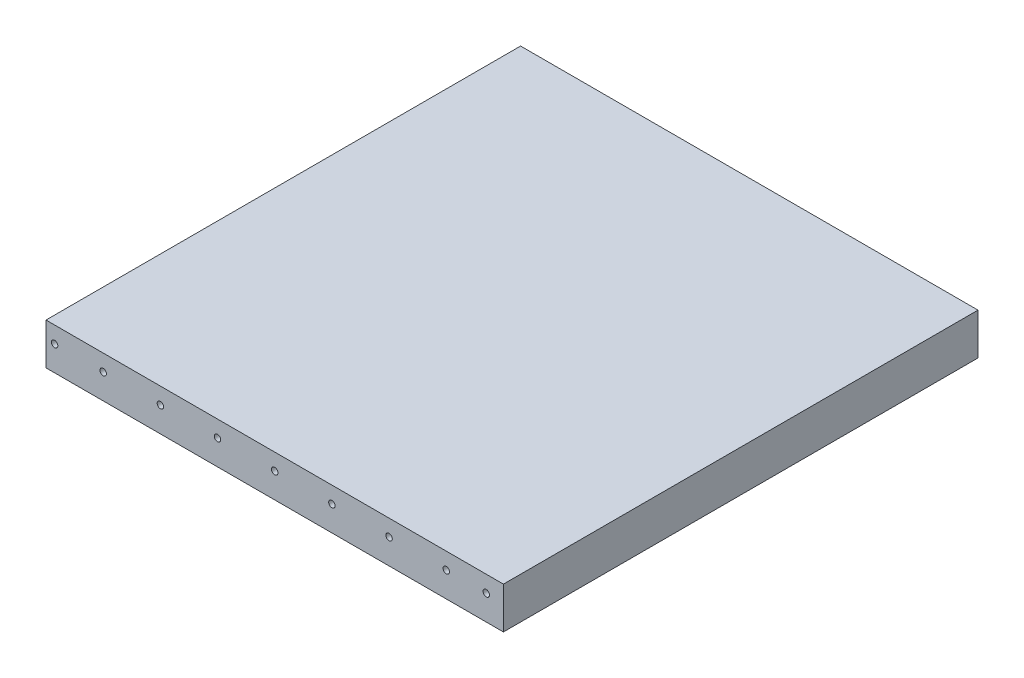
ISO-10303-21;
HEADER;
FILE_DESCRIPTION(('STEP AP214'),'2;1');
FILE_NAME('part.step','',(''),(''),'','','');
FILE_SCHEMA(('AUTOMOTIVE_DESIGN { 1 0 10303 214 1 1 1 1 }'));
ENDSEC;
DATA;
#1=APPLICATION_CONTEXT('core data for automotive mechanical design processes');
#2=APPLICATION_PROTOCOL_DEFINITION('international standard','automotive_design',2000,#1);
#3=PRODUCT_CONTEXT('',#1,'mechanical');
#4=PRODUCT('Part','Part','',(#3));
#5=PRODUCT_RELATED_PRODUCT_CATEGORY('part','',(#4));
#6=PRODUCT_DEFINITION_FORMATION('','',#4);
#7=PRODUCT_DEFINITION_CONTEXT('part definition',#1,'design');
#8=PRODUCT_DEFINITION('design','',#6,#7);
#9=PRODUCT_DEFINITION_SHAPE('','',#8);
#10=(LENGTH_UNIT() NAMED_UNIT(*) SI_UNIT(.MILLI.,.METRE.));
#11=(NAMED_UNIT(*) PLANE_ANGLE_UNIT() SI_UNIT($,.RADIAN.));
#12=(NAMED_UNIT(*) SI_UNIT($,.STERADIAN.) SOLID_ANGLE_UNIT());
#13=UNCERTAINTY_MEASURE_WITH_UNIT(LENGTH_MEASURE(1.E-05),#10,'distance_accuracy_value','');
#14=(GEOMETRIC_REPRESENTATION_CONTEXT(3) GLOBAL_UNCERTAINTY_ASSIGNED_CONTEXT((#13)) GLOBAL_UNIT_ASSIGNED_CONTEXT((#10,
#11,#12)) REPRESENTATION_CONTEXT('',''));
#15=CARTESIAN_POINT('',(0.,0.,0.));
#16=DIRECTION('',(0.,0.,1.));
#17=DIRECTION('',(1.,0.,0.));
#18=AXIS2_PLACEMENT_3D('',#15,#16,#17);
#19=CARTESIAN_POINT('',(0.,0.,2108.2));
#20=DIRECTION('',(1.,0.,0.));
#21=DIRECTION('',(0.,0.,-1.));
#22=AXIS2_PLACEMENT_3D('',#19,#20,#21);
#23=PLANE('',#22);
#24=DIRECTION('',(0.,-1.,0.));
#25=VECTOR('',#24,1.);
#26=CARTESIAN_POINT('',(0.,0.,0.));
#27=LINE('',#26,#25);
#28=CARTESIAN_POINT('',(0.,184.15,0.));
#29=VERTEX_POINT('',#28);
#30=CARTESIAN_POINT('',(0.,0.,0.));
#31=VERTEX_POINT('',#30);
#32=EDGE_CURVE('E102',#29,#31,#27,.T.);
#33=ORIENTED_EDGE('',*,*,#32,.T.);
#34=DIRECTION('',(0.,0.,-1.));
#35=VECTOR('',#34,1.);
#36=CARTESIAN_POINT('',(0.,0.,2108.2));
#37=LINE('',#36,#35);
#38=CARTESIAN_POINT('',(0.,0.,2108.2));
#39=VERTEX_POINT('',#38);
#40=EDGE_CURVE('E11',#39,#31,#37,.T.);
#41=ORIENTED_EDGE('',*,*,#40,.F.);
#42=DIRECTION('',(0.,-1.,0.));
#43=VECTOR('',#42,1.);
#44=CARTESIAN_POINT('',(0.,0.,2108.2));
#45=LINE('',#44,#43);
#46=CARTESIAN_POINT('',(0.,184.15,2108.2));
#47=VERTEX_POINT('',#46);
#48=EDGE_CURVE('E90',#47,#39,#45,.T.);
#49=ORIENTED_EDGE('',*,*,#48,.F.);
#50=DIRECTION('',(0.,0.,-1.));
#51=VECTOR('',#50,1.);
#52=CARTESIAN_POINT('',(0.,184.15,2108.2));
#53=LINE('',#52,#51);
#54=EDGE_CURVE('E98',#47,#29,#53,.T.);
#55=ORIENTED_EDGE('',*,*,#54,.T.);
#56=EDGE_LOOP('',(#33,#41,#49,#55));
#57=FACE_BOUND('',#56,.T.);
#58=ADVANCED_FACE('F39',(#57),#23,.F.);
#59=CARTESIAN_POINT('',(0.,0.,2108.2));
#60=DIRECTION('',(0.,1.,0.));
#61=DIRECTION('',(0.,0.,1.));
#62=AXIS2_PLACEMENT_3D('',#59,#60,#61);
#63=PLANE('',#62);
#64=DIRECTION('',(1.,0.,0.));
#65=VECTOR('',#64,1.);
#66=CARTESIAN_POINT('',(0.,0.,0.));
#67=LINE('',#66,#65);
#68=CARTESIAN_POINT('',(2032.,0.,0.));
#69=VERTEX_POINT('',#68);
#70=EDGE_CURVE('E94',#31,#69,#67,.T.);
#71=ORIENTED_EDGE('',*,*,#70,.T.);
#72=DIRECTION('',(0.,0.,-1.));
#73=VECTOR('',#72,1.);
#74=CARTESIAN_POINT('',(2032.,0.,2108.2));
#75=LINE('',#74,#73);
#76=CARTESIAN_POINT('',(2032.,0.,2108.2));
#77=VERTEX_POINT('',#76);
#78=EDGE_CURVE('E47',#77,#69,#75,.T.);
#79=ORIENTED_EDGE('',*,*,#78,.F.);
#80=DIRECTION('',(1.,0.,0.));
#81=VECTOR('',#80,1.);
#82=CARTESIAN_POINT('',(0.,0.,2108.2));
#83=LINE('',#82,#81);
#84=EDGE_CURVE('E85',#39,#77,#83,.T.);
#85=ORIENTED_EDGE('',*,*,#84,.F.);
#86=ORIENTED_EDGE('',*,*,#40,.T.);
#87=EDGE_LOOP('',(#71,#79,#85,#86));
#88=FACE_BOUND('',#87,.T.);
#89=ADVANCED_FACE('F93',(#88),#63,.F.);
#90=CARTESIAN_POINT('',(2032.,0.,2108.2));
#91=DIRECTION('',(-1.,0.,0.));
#92=DIRECTION('',(0.,0.,1.));
#93=AXIS2_PLACEMENT_3D('',#90,#91,#92);
#94=PLANE('',#93);
#95=DIRECTION('',(0.,1.,0.));
#96=VECTOR('',#95,1.);
#97=CARTESIAN_POINT('',(2032.,0.,0.));
#98=LINE('',#97,#96);
#99=CARTESIAN_POINT('',(2032.,184.15,0.));
#100=VERTEX_POINT('',#99);
#101=EDGE_CURVE('E72',#69,#100,#98,.T.);
#102=ORIENTED_EDGE('',*,*,#101,.T.);
#103=DIRECTION('',(0.,0.,-1.));
#104=VECTOR('',#103,1.);
#105=CARTESIAN_POINT('',(2032.,184.15,2108.2));
#106=LINE('',#105,#104);
#107=CARTESIAN_POINT('',(2032.,184.15,2108.2));
#108=VERTEX_POINT('',#107);
#109=EDGE_CURVE('E95',#108,#100,#106,.T.);
#110=ORIENTED_EDGE('',*,*,#109,.F.);
#111=DIRECTION('',(0.,1.,0.));
#112=VECTOR('',#111,1.);
#113=CARTESIAN_POINT('',(2032.,0.,2108.2));
#114=LINE('',#113,#112);
#115=EDGE_CURVE('E88',#77,#108,#114,.T.);
#116=ORIENTED_EDGE('',*,*,#115,.F.);
#117=ORIENTED_EDGE('',*,*,#78,.T.);
#118=EDGE_LOOP('',(#102,#110,#116,#117));
#119=FACE_BOUND('',#118,.T.);
#120=ADVANCED_FACE('F96',(#119),#94,.F.);
#121=CARTESIAN_POINT('',(0.,184.15,2108.2));
#122=DIRECTION('',(0.,-1.,0.));
#123=DIRECTION('',(0.,0.,-1.));
#124=AXIS2_PLACEMENT_3D('',#121,#122,#123);
#125=PLANE('',#124);
#126=DIRECTION('',(-1.,0.,0.));
#127=VECTOR('',#126,1.);
#128=CARTESIAN_POINT('',(0.,184.15,0.));
#129=LINE('',#128,#127);
#130=EDGE_CURVE('E78',#100,#29,#129,.T.);
#131=ORIENTED_EDGE('',*,*,#130,.T.);
#132=ORIENTED_EDGE('',*,*,#54,.F.);
#133=DIRECTION('',(-1.,0.,0.));
#134=VECTOR('',#133,1.);
#135=CARTESIAN_POINT('',(0.,184.15,2108.2));
#136=LINE('',#135,#134);
#137=EDGE_CURVE('E55',#108,#47,#136,.T.);
#138=ORIENTED_EDGE('',*,*,#137,.F.);
#139=ORIENTED_EDGE('',*,*,#109,.T.);
#140=EDGE_LOOP('',(#131,#132,#138,#139));
#141=FACE_BOUND('',#140,.T.);
#142=ADVANCED_FACE('F110',(#141),#125,.F.);
#143=CARTESIAN_POINT('',(0.,0.,2108.2));
#144=DIRECTION('',(0.,0.,-1.));
#145=DIRECTION('',(-1.,0.,0.));
#146=AXIS2_PLACEMENT_3D('',#143,#144,#145);
#147=PLANE('',#146);
#148=CARTESIAN_POINT('',(38.1,111.125,2108.2));
#149=DIRECTION('',(0.,0.,1.));
#150=DIRECTION('',(1.,0.,0.));
#151=AXIS2_PLACEMENT_3D('',#148,#149,#150);
#152=CIRCLE('',#151,14.2875);
#153=CARTESIAN_POINT('',(52.3875,111.125,2108.2));
#154=VERTEX_POINT('',#153);
#155=EDGE_CURVE('E105',#154,#154,#152,.T.);
#156=ORIENTED_EDGE('',*,*,#155,.F.);
#157=EDGE_LOOP('',(#156));
#158=FACE_BOUND('',#157,.T.);
#159=CARTESIAN_POINT('',(254.,111.125,2108.2));
#160=DIRECTION('',(0.,0.,1.));
#161=DIRECTION('',(1.,0.,0.));
#162=AXIS2_PLACEMENT_3D('',#159,#160,#161);
#163=CIRCLE('',#162,14.2875);
#164=CARTESIAN_POINT('',(268.2875,111.125,2108.2));
#165=VERTEX_POINT('',#164);
#166=EDGE_CURVE('E158',#165,#165,#163,.T.);
#167=ORIENTED_EDGE('',*,*,#166,.F.);
#168=EDGE_LOOP('',(#167));
#169=FACE_BOUND('',#168,.T.);
#170=CARTESIAN_POINT('',(508.,111.125,2108.2));
#171=DIRECTION('',(0.,0.,1.));
#172=DIRECTION('',(1.,0.,0.));
#173=AXIS2_PLACEMENT_3D('',#170,#171,#172);
#174=CIRCLE('',#173,14.2875);
#175=CARTESIAN_POINT('',(522.2875,111.125,2108.2));
#176=VERTEX_POINT('',#175);
#177=EDGE_CURVE('E152',#176,#176,#174,.T.);
#178=ORIENTED_EDGE('',*,*,#177,.F.);
#179=EDGE_LOOP('',(#178));
#180=FACE_BOUND('',#179,.T.);
#181=CARTESIAN_POINT('',(762.,111.125,2108.2));
#182=DIRECTION('',(0.,0.,1.));
#183=DIRECTION('',(1.,0.,0.));
#184=AXIS2_PLACEMENT_3D('',#181,#182,#183);
#185=CIRCLE('',#184,14.2875);
#186=CARTESIAN_POINT('',(776.2875,111.125,2108.2));
#187=VERTEX_POINT('',#186);
#188=EDGE_CURVE('E146',#187,#187,#185,.T.);
#189=ORIENTED_EDGE('',*,*,#188,.F.);
#190=EDGE_LOOP('',(#189));
#191=FACE_BOUND('',#190,.T.);
#192=CARTESIAN_POINT('',(1016.,111.125,2108.2));
#193=DIRECTION('',(0.,0.,1.));
#194=DIRECTION('',(1.,0.,0.));
#195=AXIS2_PLACEMENT_3D('',#192,#193,#194);
#196=CIRCLE('',#195,14.2874999999999);
#197=CARTESIAN_POINT('',(1030.2875,111.125,2108.2));
#198=VERTEX_POINT('',#197);
#199=EDGE_CURVE('E140',#198,#198,#196,.T.);
#200=ORIENTED_EDGE('',*,*,#199,.F.);
#201=EDGE_LOOP('',(#200));
#202=FACE_BOUND('',#201,.T.);
#203=CARTESIAN_POINT('',(1270.,111.125,2108.2));
#204=DIRECTION('',(0.,0.,1.));
#205=DIRECTION('',(1.,0.,0.));
#206=AXIS2_PLACEMENT_3D('',#203,#204,#205);
#207=CIRCLE('',#206,14.2874999999999);
#208=CARTESIAN_POINT('',(1284.2875,111.125,2108.2));
#209=VERTEX_POINT('',#208);
#210=EDGE_CURVE('E134',#209,#209,#207,.T.);
#211=ORIENTED_EDGE('',*,*,#210,.F.);
#212=EDGE_LOOP('',(#211));
#213=FACE_BOUND('',#212,.T.);
#214=CARTESIAN_POINT('',(1524.,111.125,2108.2));
#215=DIRECTION('',(0.,0.,1.));
#216=DIRECTION('',(1.,0.,0.));
#217=AXIS2_PLACEMENT_3D('',#214,#215,#216);
#218=CIRCLE('',#217,14.2874999999999);
#219=CARTESIAN_POINT('',(1538.2875,111.125,2108.2));
#220=VERTEX_POINT('',#219);
#221=EDGE_CURVE('E128',#220,#220,#218,.T.);
#222=ORIENTED_EDGE('',*,*,#221,.F.);
#223=EDGE_LOOP('',(#222));
#224=FACE_BOUND('',#223,.T.);
#225=CARTESIAN_POINT('',(1778.,111.125,2108.2));
#226=DIRECTION('',(0.,0.,1.));
#227=DIRECTION('',(1.,0.,0.));
#228=AXIS2_PLACEMENT_3D('',#225,#226,#227);
#229=CIRCLE('',#228,14.2874999999999);
#230=CARTESIAN_POINT('',(1792.2875,111.125,2108.2));
#231=VERTEX_POINT('',#230);
#232=EDGE_CURVE('E122',#231,#231,#229,.T.);
#233=ORIENTED_EDGE('',*,*,#232,.F.);
#234=EDGE_LOOP('',(#233));
#235=FACE_BOUND('',#234,.T.);
#236=CARTESIAN_POINT('',(1955.8,111.125,2108.2));
#237=DIRECTION('',(0.,0.,1.));
#238=DIRECTION('',(1.,0.,0.));
#239=AXIS2_PLACEMENT_3D('',#236,#237,#238);
#240=CIRCLE('',#239,14.2874999999999);
#241=CARTESIAN_POINT('',(1970.0875,111.125,2108.2));
#242=VERTEX_POINT('',#241);
#243=EDGE_CURVE('E116',#242,#242,#240,.T.);
#244=ORIENTED_EDGE('',*,*,#243,.F.);
#245=EDGE_LOOP('',(#244));
#246=FACE_BOUND('',#245,.T.);
#247=ORIENTED_EDGE('',*,*,#48,.T.);
#248=ORIENTED_EDGE('',*,*,#84,.T.);
#249=ORIENTED_EDGE('',*,*,#115,.T.);
#250=ORIENTED_EDGE('',*,*,#137,.T.);
#251=EDGE_LOOP('',(#247,#248,#249,#250));
#252=FACE_BOUND('',#251,.T.);
#253=ADVANCED_FACE('F86',(#158,#169,#180,#191,#202,#213,#224,#235,#246,#252),#147,.F.);
#254=CARTESIAN_POINT('',(0.,0.,0.));
#255=DIRECTION('',(0.,0.,-1.));
#256=DIRECTION('',(-1.,0.,0.));
#257=AXIS2_PLACEMENT_3D('',#254,#255,#256);
#258=PLANE('',#257);
#259=CARTESIAN_POINT('',(38.1,111.125,0.));
#260=DIRECTION('',(0.,0.,1.));
#261=DIRECTION('',(1.,0.,0.));
#262=AXIS2_PLACEMENT_3D('',#259,#260,#261);
#263=CIRCLE('',#262,14.2875);
#264=CARTESIAN_POINT('',(52.3875,111.125,0.));
#265=VERTEX_POINT('',#264);
#266=EDGE_CURVE('E164',#265,#265,#263,.T.);
#267=ORIENTED_EDGE('',*,*,#266,.T.);
#268=EDGE_LOOP('',(#267));
#269=FACE_BOUND('',#268,.T.);
#270=CARTESIAN_POINT('',(254.,111.125,0.));
#271=DIRECTION('',(0.,0.,1.));
#272=DIRECTION('',(1.,0.,0.));
#273=AXIS2_PLACEMENT_3D('',#270,#271,#272);
#274=CIRCLE('',#273,14.2875);
#275=CARTESIAN_POINT('',(268.2875,111.125,0.));
#276=VERTEX_POINT('',#275);
#277=EDGE_CURVE('E161',#276,#276,#274,.T.);
#278=ORIENTED_EDGE('',*,*,#277,.T.);
#279=EDGE_LOOP('',(#278));
#280=FACE_BOUND('',#279,.T.);
#281=CARTESIAN_POINT('',(508.,111.125,0.));
#282=DIRECTION('',(0.,0.,1.));
#283=DIRECTION('',(1.,0.,0.));
#284=AXIS2_PLACEMENT_3D('',#281,#282,#283);
#285=CIRCLE('',#284,14.2875);
#286=CARTESIAN_POINT('',(522.2875,111.125,0.));
#287=VERTEX_POINT('',#286);
#288=EDGE_CURVE('E155',#287,#287,#285,.T.);
#289=ORIENTED_EDGE('',*,*,#288,.T.);
#290=EDGE_LOOP('',(#289));
#291=FACE_BOUND('',#290,.T.);
#292=CARTESIAN_POINT('',(762.,111.125,0.));
#293=DIRECTION('',(0.,0.,1.));
#294=DIRECTION('',(1.,0.,0.));
#295=AXIS2_PLACEMENT_3D('',#292,#293,#294);
#296=CIRCLE('',#295,14.2875);
#297=CARTESIAN_POINT('',(776.2875,111.125,0.));
#298=VERTEX_POINT('',#297);
#299=EDGE_CURVE('E149',#298,#298,#296,.T.);
#300=ORIENTED_EDGE('',*,*,#299,.T.);
#301=EDGE_LOOP('',(#300));
#302=FACE_BOUND('',#301,.T.);
#303=CARTESIAN_POINT('',(1016.,111.125,0.));
#304=DIRECTION('',(0.,0.,1.));
#305=DIRECTION('',(1.,0.,0.));
#306=AXIS2_PLACEMENT_3D('',#303,#304,#305);
#307=CIRCLE('',#306,14.2874999999999);
#308=CARTESIAN_POINT('',(1030.2875,111.125,0.));
#309=VERTEX_POINT('',#308);
#310=EDGE_CURVE('E143',#309,#309,#307,.T.);
#311=ORIENTED_EDGE('',*,*,#310,.T.);
#312=EDGE_LOOP('',(#311));
#313=FACE_BOUND('',#312,.T.);
#314=CARTESIAN_POINT('',(1270.,111.125,0.));
#315=DIRECTION('',(0.,0.,1.));
#316=DIRECTION('',(1.,0.,0.));
#317=AXIS2_PLACEMENT_3D('',#314,#315,#316);
#318=CIRCLE('',#317,14.2874999999999);
#319=CARTESIAN_POINT('',(1284.2875,111.125,0.));
#320=VERTEX_POINT('',#319);
#321=EDGE_CURVE('E137',#320,#320,#318,.T.);
#322=ORIENTED_EDGE('',*,*,#321,.T.);
#323=EDGE_LOOP('',(#322));
#324=FACE_BOUND('',#323,.T.);
#325=CARTESIAN_POINT('',(1524.,111.125,0.));
#326=DIRECTION('',(0.,0.,1.));
#327=DIRECTION('',(1.,0.,0.));
#328=AXIS2_PLACEMENT_3D('',#325,#326,#327);
#329=CIRCLE('',#328,14.2874999999999);
#330=CARTESIAN_POINT('',(1538.2875,111.125,0.));
#331=VERTEX_POINT('',#330);
#332=EDGE_CURVE('E131',#331,#331,#329,.T.);
#333=ORIENTED_EDGE('',*,*,#332,.T.);
#334=EDGE_LOOP('',(#333));
#335=FACE_BOUND('',#334,.T.);
#336=CARTESIAN_POINT('',(1778.,111.125,0.));
#337=DIRECTION('',(0.,0.,1.));
#338=DIRECTION('',(1.,0.,0.));
#339=AXIS2_PLACEMENT_3D('',#336,#337,#338);
#340=CIRCLE('',#339,14.2874999999999);
#341=CARTESIAN_POINT('',(1792.2875,111.125,0.));
#342=VERTEX_POINT('',#341);
#343=EDGE_CURVE('E125',#342,#342,#340,.T.);
#344=ORIENTED_EDGE('',*,*,#343,.T.);
#345=EDGE_LOOP('',(#344));
#346=FACE_BOUND('',#345,.T.);
#347=CARTESIAN_POINT('',(1955.8,111.125,0.));
#348=DIRECTION('',(0.,0.,1.));
#349=DIRECTION('',(1.,0.,0.));
#350=AXIS2_PLACEMENT_3D('',#347,#348,#349);
#351=CIRCLE('',#350,14.2874999999999);
#352=CARTESIAN_POINT('',(1970.0875,111.125,0.));
#353=VERTEX_POINT('',#352);
#354=EDGE_CURVE('E119',#353,#353,#351,.T.);
#355=ORIENTED_EDGE('',*,*,#354,.T.);
#356=EDGE_LOOP('',(#355));
#357=FACE_BOUND('',#356,.T.);
#358=ORIENTED_EDGE('',*,*,#32,.F.);
#359=ORIENTED_EDGE('',*,*,#130,.F.);
#360=ORIENTED_EDGE('',*,*,#101,.F.);
#361=ORIENTED_EDGE('',*,*,#70,.F.);
#362=EDGE_LOOP('',(#358,#359,#360,#361));
#363=FACE_BOUND('',#362,.T.);
#364=ADVANCED_FACE('F113',(#269,#280,#291,#302,#313,#324,#335,#346,#357,#363),#258,.T.);
#365=CARTESIAN_POINT('',(1955.8,111.125,2108.2));
#366=DIRECTION('',(0.,0.,-1.));
#367=DIRECTION('',(-1.,0.,0.));
#368=AXIS2_PLACEMENT_3D('',#365,#366,#367);
#369=CYLINDRICAL_SURFACE('',#368,14.2874999999999);
#370=ORIENTED_EDGE('',*,*,#243,.T.);
#371=EDGE_LOOP('',(#370));
#372=FACE_BOUND('',#371,.T.);
#373=ORIENTED_EDGE('',*,*,#354,.F.);
#374=EDGE_LOOP('',(#373));
#375=FACE_BOUND('',#374,.T.);
#376=ADVANCED_FACE('F192',(#372,#375),#369,.F.);
#377=CARTESIAN_POINT('',(1778.,111.125,2108.2));
#378=DIRECTION('',(0.,0.,-1.));
#379=DIRECTION('',(-1.,0.,0.));
#380=AXIS2_PLACEMENT_3D('',#377,#378,#379);
#381=CYLINDRICAL_SURFACE('',#380,14.2874999999999);
#382=ORIENTED_EDGE('',*,*,#232,.T.);
#383=EDGE_LOOP('',(#382));
#384=FACE_BOUND('',#383,.T.);
#385=ORIENTED_EDGE('',*,*,#343,.F.);
#386=EDGE_LOOP('',(#385));
#387=FACE_BOUND('',#386,.T.);
#388=ADVANCED_FACE('F195',(#384,#387),#381,.F.);
#389=CARTESIAN_POINT('',(1524.,111.125,2108.2));
#390=DIRECTION('',(0.,0.,-1.));
#391=DIRECTION('',(-1.,0.,0.));
#392=AXIS2_PLACEMENT_3D('',#389,#390,#391);
#393=CYLINDRICAL_SURFACE('',#392,14.2874999999999);
#394=ORIENTED_EDGE('',*,*,#221,.T.);
#395=EDGE_LOOP('',(#394));
#396=FACE_BOUND('',#395,.T.);
#397=ORIENTED_EDGE('',*,*,#332,.F.);
#398=EDGE_LOOP('',(#397));
#399=FACE_BOUND('',#398,.T.);
#400=ADVANCED_FACE('F244',(#396,#399),#393,.F.);
#401=CARTESIAN_POINT('',(1270.,111.125,2108.2));
#402=DIRECTION('',(0.,0.,-1.));
#403=DIRECTION('',(-1.,0.,0.));
#404=AXIS2_PLACEMENT_3D('',#401,#402,#403);
#405=CYLINDRICAL_SURFACE('',#404,14.2874999999999);
#406=ORIENTED_EDGE('',*,*,#210,.T.);
#407=EDGE_LOOP('',(#406));
#408=FACE_BOUND('',#407,.T.);
#409=ORIENTED_EDGE('',*,*,#321,.F.);
#410=EDGE_LOOP('',(#409));
#411=FACE_BOUND('',#410,.T.);
#412=ADVANCED_FACE('F254',(#408,#411),#405,.F.);
#413=CARTESIAN_POINT('',(1016.,111.125,2108.2));
#414=DIRECTION('',(0.,0.,-1.));
#415=DIRECTION('',(-1.,0.,0.));
#416=AXIS2_PLACEMENT_3D('',#413,#414,#415);
#417=CYLINDRICAL_SURFACE('',#416,14.2874999999999);
#418=ORIENTED_EDGE('',*,*,#199,.T.);
#419=EDGE_LOOP('',(#418));
#420=FACE_BOUND('',#419,.T.);
#421=ORIENTED_EDGE('',*,*,#310,.F.);
#422=EDGE_LOOP('',(#421));
#423=FACE_BOUND('',#422,.T.);
#424=ADVANCED_FACE('F264',(#420,#423),#417,.F.);
#425=CARTESIAN_POINT('',(762.,111.125,2108.2));
#426=DIRECTION('',(0.,0.,-1.));
#427=DIRECTION('',(-1.,0.,0.));
#428=AXIS2_PLACEMENT_3D('',#425,#426,#427);
#429=CYLINDRICAL_SURFACE('',#428,14.2875);
#430=ORIENTED_EDGE('',*,*,#188,.T.);
#431=EDGE_LOOP('',(#430));
#432=FACE_BOUND('',#431,.T.);
#433=ORIENTED_EDGE('',*,*,#299,.F.);
#434=EDGE_LOOP('',(#433));
#435=FACE_BOUND('',#434,.T.);
#436=ADVANCED_FACE('F274',(#432,#435),#429,.F.);
#437=CARTESIAN_POINT('',(508.,111.125,2108.2));
#438=DIRECTION('',(0.,0.,-1.));
#439=DIRECTION('',(-1.,0.,0.));
#440=AXIS2_PLACEMENT_3D('',#437,#438,#439);
#441=CYLINDRICAL_SURFACE('',#440,14.2875);
#442=ORIENTED_EDGE('',*,*,#177,.T.);
#443=EDGE_LOOP('',(#442));
#444=FACE_BOUND('',#443,.T.);
#445=ORIENTED_EDGE('',*,*,#288,.F.);
#446=EDGE_LOOP('',(#445));
#447=FACE_BOUND('',#446,.T.);
#448=ADVANCED_FACE('F284',(#444,#447),#441,.F.);
#449=CARTESIAN_POINT('',(254.,111.125,2108.2));
#450=DIRECTION('',(0.,0.,-1.));
#451=DIRECTION('',(-1.,0.,0.));
#452=AXIS2_PLACEMENT_3D('',#449,#450,#451);
#453=CYLINDRICAL_SURFACE('',#452,14.2875);
#454=ORIENTED_EDGE('',*,*,#166,.T.);
#455=EDGE_LOOP('',(#454));
#456=FACE_BOUND('',#455,.T.);
#457=ORIENTED_EDGE('',*,*,#277,.F.);
#458=EDGE_LOOP('',(#457));
#459=FACE_BOUND('',#458,.T.);
#460=ADVANCED_FACE('F294',(#456,#459),#453,.F.);
#461=CARTESIAN_POINT('',(38.1,111.125,2108.2));
#462=DIRECTION('',(0.,0.,-1.));
#463=DIRECTION('',(-1.,0.,0.));
#464=AXIS2_PLACEMENT_3D('',#461,#462,#463);
#465=CYLINDRICAL_SURFACE('',#464,14.2875);
#466=ORIENTED_EDGE('',*,*,#155,.T.);
#467=EDGE_LOOP('',(#466));
#468=FACE_BOUND('',#467,.T.);
#469=ORIENTED_EDGE('',*,*,#266,.F.);
#470=EDGE_LOOP('',(#469));
#471=FACE_BOUND('',#470,.T.);
#472=ADVANCED_FACE('F170',(#468,#471),#465,.F.);
#473=CLOSED_SHELL('',(#58,#89,#120,#142,#253,#364,#376,#388,#400,#412,#424,#436,#448,#460,#472));
#474=MANIFOLD_SOLID_BREP('B2',#473);
#475=ADVANCED_BREP_SHAPE_REPRESENTATION('',(#18,#474),#14);
#476=SHAPE_DEFINITION_REPRESENTATION(#9,#475);
ENDSEC;
END-ISO-10303-21;
